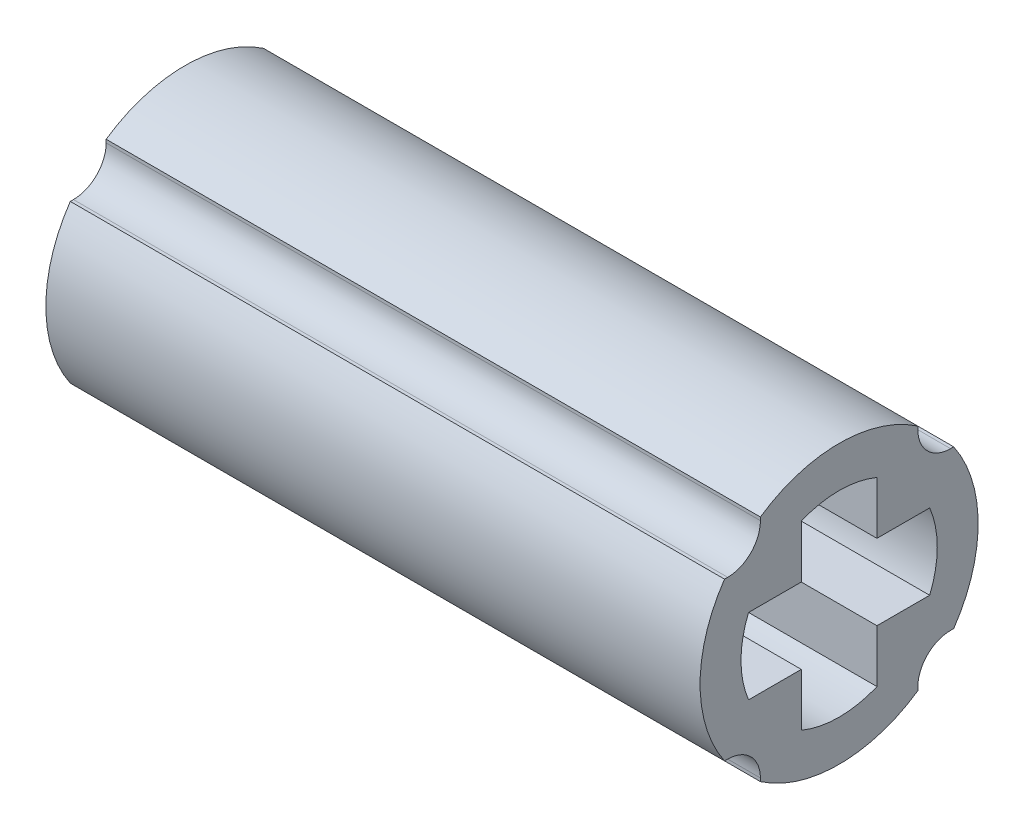
ISO-10303-21;
HEADER;
FILE_DESCRIPTION(('STEP AP214'),'2;1');
FILE_NAME('part.step','',(''),(''),'','','');
FILE_SCHEMA(('AUTOMOTIVE_DESIGN { 1 0 10303 214 1 1 1 1 }'));
ENDSEC;
DATA;
#1=APPLICATION_CONTEXT('core data for automotive mechanical design processes');
#2=APPLICATION_PROTOCOL_DEFINITION('international standard','automotive_design',2000,#1);
#3=PRODUCT_CONTEXT('',#1,'mechanical');
#4=PRODUCT('Part','Part','',(#3));
#5=PRODUCT_RELATED_PRODUCT_CATEGORY('part','',(#4));
#6=PRODUCT_DEFINITION_FORMATION('','',#4);
#7=PRODUCT_DEFINITION_CONTEXT('part definition',#1,'design');
#8=PRODUCT_DEFINITION('design','',#6,#7);
#9=PRODUCT_DEFINITION_SHAPE('','',#8);
#10=(LENGTH_UNIT() NAMED_UNIT(*) SI_UNIT(.MILLI.,.METRE.));
#11=(NAMED_UNIT(*) PLANE_ANGLE_UNIT() SI_UNIT($,.RADIAN.));
#12=(NAMED_UNIT(*) SI_UNIT($,.STERADIAN.) SOLID_ANGLE_UNIT());
#13=UNCERTAINTY_MEASURE_WITH_UNIT(LENGTH_MEASURE(1.E-05),#10,'distance_accuracy_value','');
#14=(GEOMETRIC_REPRESENTATION_CONTEXT(3) GLOBAL_UNCERTAINTY_ASSIGNED_CONTEXT((#13)) GLOBAL_UNIT_ASSIGNED_CONTEXT((#10,
#11,#12)) REPRESENTATION_CONTEXT('',''));
#15=CARTESIAN_POINT('',(0.,0.,0.));
#16=DIRECTION('',(0.,0.,1.));
#17=DIRECTION('',(1.,0.,0.));
#18=AXIS2_PLACEMENT_3D('',#15,#16,#17);
#19=CARTESIAN_POINT('',(16.,0.925,-0.925));
#20=DIRECTION('',(0.,0.,1.));
#21=DIRECTION('',(0.,-1.,0.));
#22=AXIS2_PLACEMENT_3D('',#19,#20,#21);
#23=PLANE('',#22);
#24=DIRECTION('',(0.,1.,0.));
#25=VECTOR('',#24,1.);
#26=CARTESIAN_POINT('',(0.,0.925,-0.925));
#27=LINE('',#26,#25);
#28=CARTESIAN_POINT('',(0.,0.925,-0.925));
#29=VERTEX_POINT('',#28);
#30=CARTESIAN_POINT('',(0.,2.2145823534021,-0.925));
#31=VERTEX_POINT('',#30);
#32=EDGE_CURVE('E279',#29,#31,#27,.T.);
#33=ORIENTED_EDGE('',*,*,#32,.F.);
#34=DIRECTION('',(-1.,0.,0.));
#35=VECTOR('',#34,1.);
#36=CARTESIAN_POINT('',(16.,0.925,-0.925));
#37=LINE('',#36,#35);
#38=CARTESIAN_POINT('',(16.,0.925,-0.925));
#39=VERTEX_POINT('',#38);
#40=EDGE_CURVE('E10',#39,#29,#37,.T.);
#41=ORIENTED_EDGE('',*,*,#40,.F.);
#42=DIRECTION('',(0.,1.,0.));
#43=VECTOR('',#42,1.);
#44=CARTESIAN_POINT('',(16.,0.925,-0.925));
#45=LINE('',#44,#43);
#46=CARTESIAN_POINT('',(16.,2.2145823534021,-0.925));
#47=VERTEX_POINT('',#46);
#48=EDGE_CURVE('E481',#39,#47,#45,.T.);
#49=ORIENTED_EDGE('',*,*,#48,.T.);
#50=DIRECTION('',(-1.,0.,0.));
#51=VECTOR('',#50,1.);
#52=CARTESIAN_POINT('',(16.,2.2145823534021,-0.925));
#53=LINE('',#52,#51);
#54=EDGE_CURVE('E331',#47,#31,#53,.T.);
#55=ORIENTED_EDGE('',*,*,#54,.T.);
#56=EDGE_LOOP('',(#33,#41,#49,#55));
#57=FACE_BOUND('',#56,.T.);
#58=ADVANCED_FACE('F16',(#57),#23,.T.);
#59=CARTESIAN_POINT('',(16.,0.925,-2.2145823534021));
#60=DIRECTION('',(0.,-1.,0.));
#61=DIRECTION('',(-1.,0.,0.));
#62=AXIS2_PLACEMENT_3D('',#59,#60,#61);
#63=PLANE('',#62);
#64=DIRECTION('',(0.,0.,1.));
#65=VECTOR('',#64,1.);
#66=CARTESIAN_POINT('',(0.,0.925,-2.2145823534021));
#67=LINE('',#66,#65);
#68=CARTESIAN_POINT('',(0.,0.925,-2.2145823534021));
#69=VERTEX_POINT('',#68);
#70=EDGE_CURVE('E201',#69,#29,#67,.T.);
#71=ORIENTED_EDGE('',*,*,#70,.F.);
#72=DIRECTION('',(-1.,0.,0.));
#73=VECTOR('',#72,1.);
#74=CARTESIAN_POINT('',(16.,0.925,-2.2145823534021));
#75=LINE('',#74,#73);
#76=CARTESIAN_POINT('',(16.,0.925,-2.2145823534021));
#77=VERTEX_POINT('',#76);
#78=EDGE_CURVE('E26',#77,#69,#75,.T.);
#79=ORIENTED_EDGE('',*,*,#78,.F.);
#80=DIRECTION('',(0.,0.,1.));
#81=VECTOR('',#80,1.);
#82=CARTESIAN_POINT('',(16.,0.925,-2.2145823534021));
#83=LINE('',#82,#81);
#84=EDGE_CURVE('E361',#77,#39,#83,.T.);
#85=ORIENTED_EDGE('',*,*,#84,.T.);
#86=ORIENTED_EDGE('',*,*,#40,.T.);
#87=EDGE_LOOP('',(#71,#79,#85,#86));
#88=FACE_BOUND('',#87,.T.);
#89=ADVANCED_FACE('F488',(#88),#63,.T.);
#90=CARTESIAN_POINT('',(16.,0.,0.));
#91=DIRECTION('',(-1.,0.,0.));
#92=DIRECTION('',(0.,-1.,0.));
#93=AXIS2_PLACEMENT_3D('',#90,#91,#92);
#94=CYLINDRICAL_SURFACE('',#93,2.4);
#95=CARTESIAN_POINT('',(0.,0.,0.));
#96=DIRECTION('',(1.,0.,0.));
#97=DIRECTION('',(0.,1.,0.));
#98=AXIS2_PLACEMENT_3D('',#95,#96,#97);
#99=CIRCLE('',#98,2.4);
#100=CARTESIAN_POINT('',(0.,-0.925,-2.2145823534021));
#101=VERTEX_POINT('',#100);
#102=EDGE_CURVE('E196',#101,#69,#99,.T.);
#103=ORIENTED_EDGE('',*,*,#102,.F.);
#104=DIRECTION('',(-1.,0.,0.));
#105=VECTOR('',#104,1.);
#106=CARTESIAN_POINT('',(16.,-0.925,-2.2145823534021));
#107=LINE('',#106,#105);
#108=CARTESIAN_POINT('',(16.,-0.925,-2.2145823534021));
#109=VERTEX_POINT('',#108);
#110=EDGE_CURVE('E19',#109,#101,#107,.T.);
#111=ORIENTED_EDGE('',*,*,#110,.F.);
#112=CARTESIAN_POINT('',(16.,0.,0.));
#113=DIRECTION('',(1.,0.,0.));
#114=DIRECTION('',(0.,1.,0.));
#115=AXIS2_PLACEMENT_3D('',#112,#113,#114);
#116=CIRCLE('',#115,2.4);
#117=EDGE_CURVE('E356',#109,#77,#116,.T.);
#118=ORIENTED_EDGE('',*,*,#117,.T.);
#119=ORIENTED_EDGE('',*,*,#78,.T.);
#120=EDGE_LOOP('',(#103,#111,#118,#119));
#121=FACE_BOUND('',#120,.T.);
#122=ADVANCED_FACE('F197',(#121),#94,.F.);
#123=CARTESIAN_POINT('',(16.,-0.925,-2.2145823534021));
#124=DIRECTION('',(0.,1.,0.));
#125=DIRECTION('',(0.,0.,-1.));
#126=AXIS2_PLACEMENT_3D('',#123,#124,#125);
#127=PLANE('',#126);
#128=DIRECTION('',(0.,0.,-1.));
#129=VECTOR('',#128,1.);
#130=CARTESIAN_POINT('',(0.,-0.925,-2.2145823534021));
#131=LINE('',#130,#129);
#132=CARTESIAN_POINT('',(0.,-0.925,-0.925));
#133=VERTEX_POINT('',#132);
#134=EDGE_CURVE('E186',#133,#101,#131,.T.);
#135=ORIENTED_EDGE('',*,*,#134,.F.);
#136=DIRECTION('',(-1.,0.,0.));
#137=VECTOR('',#136,1.);
#138=CARTESIAN_POINT('',(16.,-0.925,-0.925));
#139=LINE('',#138,#137);
#140=CARTESIAN_POINT('',(16.,-0.925,-0.925));
#141=VERTEX_POINT('',#140);
#142=EDGE_CURVE('E194',#141,#133,#139,.T.);
#143=ORIENTED_EDGE('',*,*,#142,.F.);
#144=DIRECTION('',(0.,0.,-1.));
#145=VECTOR('',#144,1.);
#146=CARTESIAN_POINT('',(16.,-0.925,-2.2145823534021));
#147=LINE('',#146,#145);
#148=EDGE_CURVE('E189',#141,#109,#147,.T.);
#149=ORIENTED_EDGE('',*,*,#148,.T.);
#150=ORIENTED_EDGE('',*,*,#110,.T.);
#151=EDGE_LOOP('',(#135,#143,#149,#150));
#152=FACE_BOUND('',#151,.T.);
#153=ADVANCED_FACE('F184',(#152),#127,.T.);
#154=CARTESIAN_POINT('',(16.,-2.2145823534021,-0.925));
#155=DIRECTION('',(0.,0.,1.));
#156=DIRECTION('',(0.,-1.,0.));
#157=AXIS2_PLACEMENT_3D('',#154,#155,#156);
#158=PLANE('',#157);
#159=DIRECTION('',(0.,1.,0.));
#160=VECTOR('',#159,1.);
#161=CARTESIAN_POINT('',(0.,-2.2145823534021,-0.925));
#162=LINE('',#161,#160);
#163=CARTESIAN_POINT('',(0.,-2.2145823534021,-0.925));
#164=VERTEX_POINT('',#163);
#165=EDGE_CURVE('E208',#164,#133,#162,.T.);
#166=ORIENTED_EDGE('',*,*,#165,.F.);
#167=DIRECTION('',(-1.,0.,0.));
#168=VECTOR('',#167,1.);
#169=CARTESIAN_POINT('',(16.,-2.2145823534021,-0.925));
#170=LINE('',#169,#168);
#171=CARTESIAN_POINT('',(16.,-2.2145823534021,-0.925));
#172=VERTEX_POINT('',#171);
#173=EDGE_CURVE('E313',#172,#164,#170,.T.);
#174=ORIENTED_EDGE('',*,*,#173,.F.);
#175=DIRECTION('',(0.,1.,0.));
#176=VECTOR('',#175,1.);
#177=CARTESIAN_POINT('',(16.,-2.2145823534021,-0.925));
#178=LINE('',#177,#176);
#179=EDGE_CURVE('E345',#172,#141,#178,.T.);
#180=ORIENTED_EDGE('',*,*,#179,.T.);
#181=ORIENTED_EDGE('',*,*,#142,.T.);
#182=EDGE_LOOP('',(#166,#174,#180,#181));
#183=FACE_BOUND('',#182,.T.);
#184=ADVANCED_FACE('F343',(#183),#158,.T.);
#185=CARTESIAN_POINT('',(16.,0.,0.));
#186=DIRECTION('',(-1.,0.,0.));
#187=DIRECTION('',(0.,-1.,0.));
#188=AXIS2_PLACEMENT_3D('',#185,#186,#187);
#189=CYLINDRICAL_SURFACE('',#188,2.4);
#190=CARTESIAN_POINT('',(0.,0.,0.));
#191=DIRECTION('',(1.,0.,0.));
#192=DIRECTION('',(0.,1.,0.));
#193=AXIS2_PLACEMENT_3D('',#190,#191,#192);
#194=CIRCLE('',#193,2.4);
#195=CARTESIAN_POINT('',(0.,-2.2145823534021,0.925));
#196=VERTEX_POINT('',#195);
#197=EDGE_CURVE('E214',#196,#164,#194,.T.);
#198=ORIENTED_EDGE('',*,*,#197,.F.);
#199=DIRECTION('',(-1.,0.,0.));
#200=VECTOR('',#199,1.);
#201=CARTESIAN_POINT('',(16.,-2.2145823534021,0.925));
#202=LINE('',#201,#200);
#203=CARTESIAN_POINT('',(16.,-2.2145823534021,0.925));
#204=VERTEX_POINT('',#203);
#205=EDGE_CURVE('E316',#204,#196,#202,.T.);
#206=ORIENTED_EDGE('',*,*,#205,.F.);
#207=CARTESIAN_POINT('',(16.,0.,0.));
#208=DIRECTION('',(1.,0.,0.));
#209=DIRECTION('',(0.,1.,0.));
#210=AXIS2_PLACEMENT_3D('',#207,#208,#209);
#211=CIRCLE('',#210,2.4);
#212=EDGE_CURVE('E350',#204,#172,#211,.T.);
#213=ORIENTED_EDGE('',*,*,#212,.T.);
#214=ORIENTED_EDGE('',*,*,#173,.T.);
#215=EDGE_LOOP('',(#198,#206,#213,#214));
#216=FACE_BOUND('',#215,.T.);
#217=ADVANCED_FACE('F938',(#216),#189,.F.);
#218=CARTESIAN_POINT('',(16.,-2.2145823534021,0.925));
#219=DIRECTION('',(0.,0.,-1.));
#220=DIRECTION('',(-1.,0.,0.));
#221=AXIS2_PLACEMENT_3D('',#218,#219,#220);
#222=PLANE('',#221);
#223=DIRECTION('',(0.,-1.,0.));
#224=VECTOR('',#223,1.);
#225=CARTESIAN_POINT('',(0.,-2.2145823534021,0.925));
#226=LINE('',#225,#224);
#227=CARTESIAN_POINT('',(0.,-0.925,0.925));
#228=VERTEX_POINT('',#227);
#229=EDGE_CURVE('E273',#228,#196,#226,.T.);
#230=ORIENTED_EDGE('',*,*,#229,.F.);
#231=DIRECTION('',(-1.,0.,0.));
#232=VECTOR('',#231,1.);
#233=CARTESIAN_POINT('',(16.,-0.925,0.925));
#234=LINE('',#233,#232);
#235=CARTESIAN_POINT('',(16.,-0.925,0.925));
#236=VERTEX_POINT('',#235);
#237=EDGE_CURVE('E338',#236,#228,#234,.T.);
#238=ORIENTED_EDGE('',*,*,#237,.F.);
#239=DIRECTION('',(0.,-1.,0.));
#240=VECTOR('',#239,1.);
#241=CARTESIAN_POINT('',(16.,-2.2145823534021,0.925));
#242=LINE('',#241,#240);
#243=EDGE_CURVE('E369',#236,#204,#242,.T.);
#244=ORIENTED_EDGE('',*,*,#243,.T.);
#245=ORIENTED_EDGE('',*,*,#205,.T.);
#246=EDGE_LOOP('',(#230,#238,#244,#245));
#247=FACE_BOUND('',#246,.T.);
#248=ADVANCED_FACE('F927',(#247),#222,.T.);
#249=CARTESIAN_POINT('',(16.,-0.925,0.925));
#250=DIRECTION('',(0.,1.,0.));
#251=DIRECTION('',(0.,0.,-1.));
#252=AXIS2_PLACEMENT_3D('',#249,#250,#251);
#253=PLANE('',#252);
#254=DIRECTION('',(0.,0.,-1.));
#255=VECTOR('',#254,1.);
#256=CARTESIAN_POINT('',(0.,-0.925,0.925));
#257=LINE('',#256,#255);
#258=CARTESIAN_POINT('',(0.,-0.925,2.2145823534021));
#259=VERTEX_POINT('',#258);
#260=EDGE_CURVE('E270',#259,#228,#257,.T.);
#261=ORIENTED_EDGE('',*,*,#260,.F.);
#262=DIRECTION('',(-1.,0.,0.));
#263=VECTOR('',#262,1.);
#264=CARTESIAN_POINT('',(16.,-0.925,2.2145823534021));
#265=LINE('',#264,#263);
#266=CARTESIAN_POINT('',(16.,-0.925,2.2145823534021));
#267=VERTEX_POINT('',#266);
#268=EDGE_CURVE('E292',#267,#259,#265,.T.);
#269=ORIENTED_EDGE('',*,*,#268,.F.);
#270=DIRECTION('',(0.,0.,-1.));
#271=VECTOR('',#270,1.);
#272=CARTESIAN_POINT('',(16.,-0.925,0.925));
#273=LINE('',#272,#271);
#274=EDGE_CURVE('E373',#267,#236,#273,.T.);
#275=ORIENTED_EDGE('',*,*,#274,.T.);
#276=ORIENTED_EDGE('',*,*,#237,.T.);
#277=EDGE_LOOP('',(#261,#269,#275,#276));
#278=FACE_BOUND('',#277,.T.);
#279=ADVANCED_FACE('F900',(#278),#253,.T.);
#280=CARTESIAN_POINT('',(16.,0.,0.));
#281=DIRECTION('',(-1.,0.,0.));
#282=DIRECTION('',(0.,-1.,0.));
#283=AXIS2_PLACEMENT_3D('',#280,#281,#282);
#284=CYLINDRICAL_SURFACE('',#283,2.4);
#285=CARTESIAN_POINT('',(0.,0.,0.));
#286=DIRECTION('',(1.,0.,0.));
#287=DIRECTION('',(0.,1.,0.));
#288=AXIS2_PLACEMENT_3D('',#285,#286,#287);
#289=CIRCLE('',#288,2.4);
#290=CARTESIAN_POINT('',(0.,0.925,2.2145823534021));
#291=VERTEX_POINT('',#290);
#292=EDGE_CURVE('E263',#291,#259,#289,.T.);
#293=ORIENTED_EDGE('',*,*,#292,.F.);
#294=DIRECTION('',(-1.,0.,0.));
#295=VECTOR('',#294,1.);
#296=CARTESIAN_POINT('',(16.,0.925,2.2145823534021));
#297=LINE('',#296,#295);
#298=CARTESIAN_POINT('',(16.,0.925,2.2145823534021));
#299=VERTEX_POINT('',#298);
#300=EDGE_CURVE('E289',#299,#291,#297,.T.);
#301=ORIENTED_EDGE('',*,*,#300,.F.);
#302=CARTESIAN_POINT('',(16.,0.,0.));
#303=DIRECTION('',(1.,0.,0.));
#304=DIRECTION('',(0.,1.,0.));
#305=AXIS2_PLACEMENT_3D('',#302,#303,#304);
#306=CIRCLE('',#305,2.4);
#307=EDGE_CURVE('E377',#299,#267,#306,.T.);
#308=ORIENTED_EDGE('',*,*,#307,.T.);
#309=ORIENTED_EDGE('',*,*,#268,.T.);
#310=EDGE_LOOP('',(#293,#301,#308,#309));
#311=FACE_BOUND('',#310,.T.);
#312=ADVANCED_FACE('F512',(#311),#284,.F.);
#313=CARTESIAN_POINT('',(16.,0.925,0.925));
#314=DIRECTION('',(0.,-1.,0.));
#315=DIRECTION('',(0.,0.,-1.));
#316=AXIS2_PLACEMENT_3D('',#313,#314,#315);
#317=PLANE('',#316);
#318=DIRECTION('',(0.,0.,1.));
#319=VECTOR('',#318,1.);
#320=CARTESIAN_POINT('',(0.,0.925,0.925));
#321=LINE('',#320,#319);
#322=CARTESIAN_POINT('',(0.,0.925,0.925));
#323=VERTEX_POINT('',#322);
#324=EDGE_CURVE('E259',#323,#291,#321,.T.);
#325=ORIENTED_EDGE('',*,*,#324,.F.);
#326=DIRECTION('',(-1.,0.,0.));
#327=VECTOR('',#326,1.);
#328=CARTESIAN_POINT('',(16.,0.925,0.925));
#329=LINE('',#328,#327);
#330=CARTESIAN_POINT('',(16.,0.925,0.925));
#331=VERTEX_POINT('',#330);
#332=EDGE_CURVE('E293',#331,#323,#329,.T.);
#333=ORIENTED_EDGE('',*,*,#332,.F.);
#334=DIRECTION('',(0.,0.,1.));
#335=VECTOR('',#334,1.);
#336=CARTESIAN_POINT('',(16.,0.925,0.925));
#337=LINE('',#336,#335);
#338=EDGE_CURVE('E383',#331,#299,#337,.T.);
#339=ORIENTED_EDGE('',*,*,#338,.T.);
#340=ORIENTED_EDGE('',*,*,#300,.T.);
#341=EDGE_LOOP('',(#325,#333,#339,#340));
#342=FACE_BOUND('',#341,.T.);
#343=ADVANCED_FACE('F508',(#342),#317,.T.);
#344=CARTESIAN_POINT('',(16.,0.925,0.925));
#345=DIRECTION('',(0.,0.,-1.));
#346=DIRECTION('',(-1.,0.,0.));
#347=AXIS2_PLACEMENT_3D('',#344,#345,#346);
#348=PLANE('',#347);
#349=DIRECTION('',(0.,-1.,0.));
#350=VECTOR('',#349,1.);
#351=CARTESIAN_POINT('',(0.,0.925,0.925));
#352=LINE('',#351,#350);
#353=CARTESIAN_POINT('',(0.,2.2145823534021,0.925));
#354=VERTEX_POINT('',#353);
#355=EDGE_CURVE('E255',#354,#323,#352,.T.);
#356=ORIENTED_EDGE('',*,*,#355,.F.);
#357=DIRECTION('',(-1.,0.,0.));
#358=VECTOR('',#357,1.);
#359=CARTESIAN_POINT('',(16.,2.2145823534021,0.925));
#360=LINE('',#359,#358);
#361=CARTESIAN_POINT('',(16.,2.2145823534021,0.925));
#362=VERTEX_POINT('',#361);
#363=EDGE_CURVE('E300',#362,#354,#360,.T.);
#364=ORIENTED_EDGE('',*,*,#363,.F.);
#365=DIRECTION('',(0.,-1.,0.));
#366=VECTOR('',#365,1.);
#367=CARTESIAN_POINT('',(16.,0.925,0.925));
#368=LINE('',#367,#366);
#369=EDGE_CURVE('E480',#362,#331,#368,.T.);
#370=ORIENTED_EDGE('',*,*,#369,.T.);
#371=ORIENTED_EDGE('',*,*,#332,.T.);
#372=EDGE_LOOP('',(#356,#364,#370,#371));
#373=FACE_BOUND('',#372,.T.);
#374=ADVANCED_FACE('F502',(#373),#348,.T.);
#375=CARTESIAN_POINT('',(16.,0.,0.));
#376=DIRECTION('',(-1.,0.,0.));
#377=DIRECTION('',(0.,-1.,0.));
#378=AXIS2_PLACEMENT_3D('',#375,#376,#377);
#379=CYLINDRICAL_SURFACE('',#378,2.4);
#380=CARTESIAN_POINT('',(0.,0.,0.));
#381=DIRECTION('',(1.,0.,0.));
#382=DIRECTION('',(0.,1.,0.));
#383=AXIS2_PLACEMENT_3D('',#380,#381,#382);
#384=CIRCLE('',#383,2.4);
#385=EDGE_CURVE('E252',#31,#354,#384,.T.);
#386=ORIENTED_EDGE('',*,*,#385,.F.);
#387=ORIENTED_EDGE('',*,*,#54,.F.);
#388=CARTESIAN_POINT('',(16.,0.,0.));
#389=DIRECTION('',(1.,0.,0.));
#390=DIRECTION('',(0.,1.,0.));
#391=AXIS2_PLACEMENT_3D('',#388,#389,#390);
#392=CIRCLE('',#391,2.4);
#393=EDGE_CURVE('E484',#47,#362,#392,.T.);
#394=ORIENTED_EDGE('',*,*,#393,.T.);
#395=ORIENTED_EDGE('',*,*,#363,.T.);
#396=EDGE_LOOP('',(#386,#387,#394,#395));
#397=FACE_BOUND('',#396,.T.);
#398=ADVANCED_FACE('F496',(#397),#379,.F.);
#399=CARTESIAN_POINT('',(16.,-2.80256578870149,1.925));
#400=DIRECTION('',(0.,0.,-1.));
#401=DIRECTION('',(0.,-1.,0.));
#402=AXIS2_PLACEMENT_3D('',#399,#400,#401);
#403=PLANE('',#402);
#404=DIRECTION('',(0.,-1.,0.));
#405=VECTOR('',#404,1.);
#406=CARTESIAN_POINT('',(0.,-2.80256578870149,1.925));
#407=LINE('',#406,#405);
#408=CARTESIAN_POINT('',(0.,-2.725,1.925));
#409=VERTEX_POINT('',#408);
#410=CARTESIAN_POINT('',(0.,-2.80256578870149,1.925));
#411=VERTEX_POINT('',#410);
#412=EDGE_CURVE('E391',#409,#411,#407,.T.);
#413=ORIENTED_EDGE('',*,*,#412,.T.);
#414=DIRECTION('',(-1.,0.,0.));
#415=VECTOR('',#414,1.);
#416=CARTESIAN_POINT('',(16.,-2.80256578870149,1.925));
#417=LINE('',#416,#415);
#418=CARTESIAN_POINT('',(16.,-2.80256578870149,1.925));
#419=VERTEX_POINT('',#418);
#420=EDGE_CURVE('E230',#419,#411,#417,.T.);
#421=ORIENTED_EDGE('',*,*,#420,.F.);
#422=DIRECTION('',(0.,-1.,0.));
#423=VECTOR('',#422,1.);
#424=CARTESIAN_POINT('',(16.,-2.80256578870149,1.925));
#425=LINE('',#424,#423);
#426=CARTESIAN_POINT('',(16.,-2.725,1.925));
#427=VERTEX_POINT('',#426);
#428=EDGE_CURVE('E474',#427,#419,#425,.T.);
#429=ORIENTED_EDGE('',*,*,#428,.F.);
#430=DIRECTION('',(-1.,0.,0.));
#431=VECTOR('',#430,1.);
#432=CARTESIAN_POINT('',(16.,-2.725,1.925));
#433=LINE('',#432,#431);
#434=EDGE_CURVE('E328',#427,#409,#433,.T.);
#435=ORIENTED_EDGE('',*,*,#434,.T.);
#436=EDGE_LOOP('',(#413,#421,#429,#435));
#437=FACE_BOUND('',#436,.T.);
#438=ADVANCED_FACE('F663',(#437),#403,.F.);
#439=CARTESIAN_POINT('',(16.,-2.725,2.725));
#440=DIRECTION('',(-1.,0.,0.));
#441=DIRECTION('',(0.,-1.,0.));
#442=AXIS2_PLACEMENT_3D('',#439,#440,#441);
#443=CYLINDRICAL_SURFACE('',#442,0.8);
#444=CARTESIAN_POINT('',(0.,-2.725,2.725));
#445=DIRECTION('',(-1.,0.,0.));
#446=DIRECTION('',(0.,1.,0.));
#447=AXIS2_PLACEMENT_3D('',#444,#445,#446);
#448=CIRCLE('',#447,0.8);
#449=CARTESIAN_POINT('',(0.,-1.925,2.725));
#450=VERTEX_POINT('',#449);
#451=EDGE_CURVE('E401',#450,#409,#448,.T.);
#452=ORIENTED_EDGE('',*,*,#451,.T.);
#453=ORIENTED_EDGE('',*,*,#434,.F.);
#454=CARTESIAN_POINT('',(16.,-2.725,2.725));
#455=DIRECTION('',(-1.,0.,0.));
#456=DIRECTION('',(0.,1.,0.));
#457=AXIS2_PLACEMENT_3D('',#454,#455,#456);
#458=CIRCLE('',#457,0.8);
#459=CARTESIAN_POINT('',(16.,-1.925,2.725));
#460=VERTEX_POINT('',#459);
#461=EDGE_CURVE('E466',#460,#427,#458,.T.);
#462=ORIENTED_EDGE('',*,*,#461,.F.);
#463=DIRECTION('',(-1.,0.,0.));
#464=VECTOR('',#463,1.);
#465=CARTESIAN_POINT('',(16.,-1.925,2.725));
#466=LINE('',#465,#464);
#467=EDGE_CURVE('E325',#460,#450,#466,.T.);
#468=ORIENTED_EDGE('',*,*,#467,.T.);
#469=EDGE_LOOP('',(#452,#453,#462,#468));
#470=FACE_BOUND('',#469,.T.);
#471=ADVANCED_FACE('F661',(#470),#443,.F.);
#472=CARTESIAN_POINT('',(16.,-1.925,2.725));
#473=DIRECTION('',(0.,1.,0.));
#474=DIRECTION('',(1.,0.,0.));
#475=AXIS2_PLACEMENT_3D('',#472,#473,#474);
#476=PLANE('',#475);
#477=DIRECTION('',(0.,0.,-1.));
#478=VECTOR('',#477,1.);
#479=CARTESIAN_POINT('',(0.,-1.925,2.725));
#480=LINE('',#479,#478);
#481=CARTESIAN_POINT('',(0.,-1.925,2.80256578870149));
#482=VERTEX_POINT('',#481);
#483=EDGE_CURVE('E400',#482,#450,#480,.T.);
#484=ORIENTED_EDGE('',*,*,#483,.T.);
#485=ORIENTED_EDGE('',*,*,#467,.F.);
#486=DIRECTION('',(0.,0.,-1.));
#487=VECTOR('',#486,1.);
#488=CARTESIAN_POINT('',(16.,-1.925,2.725));
#489=LINE('',#488,#487);
#490=CARTESIAN_POINT('',(16.,-1.925,2.80256578870149));
#491=VERTEX_POINT('',#490);
#492=EDGE_CURVE('E463',#491,#460,#489,.T.);
#493=ORIENTED_EDGE('',*,*,#492,.F.);
#494=DIRECTION('',(-1.,0.,0.));
#495=VECTOR('',#494,1.);
#496=CARTESIAN_POINT('',(16.,-1.925,2.80256578870149));
#497=LINE('',#496,#495);
#498=EDGE_CURVE('E322',#491,#482,#497,.T.);
#499=ORIENTED_EDGE('',*,*,#498,.T.);
#500=EDGE_LOOP('',(#484,#485,#493,#499));
#501=FACE_BOUND('',#500,.T.);
#502=ADVANCED_FACE('F657',(#501),#476,.F.);
#503=CARTESIAN_POINT('',(16.,0.,0.));
#504=DIRECTION('',(-1.,0.,0.));
#505=DIRECTION('',(0.,-1.,0.));
#506=AXIS2_PLACEMENT_3D('',#503,#504,#505);
#507=CYLINDRICAL_SURFACE('',#506,3.4);
#508=CARTESIAN_POINT('',(0.,0.,0.));
#509=DIRECTION('',(1.,0.,0.));
#510=DIRECTION('',(0.,1.,0.));
#511=AXIS2_PLACEMENT_3D('',#508,#509,#510);
#512=CIRCLE('',#511,3.4);
#513=CARTESIAN_POINT('',(0.,1.925,2.80256578870149));
#514=VERTEX_POINT('',#513);
#515=EDGE_CURVE('E395',#514,#482,#512,.T.);
#516=ORIENTED_EDGE('',*,*,#515,.T.);
#517=ORIENTED_EDGE('',*,*,#498,.F.);
#518=CARTESIAN_POINT('',(16.,0.,0.));
#519=DIRECTION('',(1.,0.,0.));
#520=DIRECTION('',(0.,1.,0.));
#521=AXIS2_PLACEMENT_3D('',#518,#519,#520);
#522=CIRCLE('',#521,3.4);
#523=CARTESIAN_POINT('',(16.,1.925,2.80256578870149));
#524=VERTEX_POINT('',#523);
#525=EDGE_CURVE('E460',#524,#491,#522,.T.);
#526=ORIENTED_EDGE('',*,*,#525,.F.);
#527=DIRECTION('',(-1.,0.,0.));
#528=VECTOR('',#527,1.);
#529=CARTESIAN_POINT('',(16.,1.925,2.80256578870149));
#530=LINE('',#529,#528);
#531=EDGE_CURVE('E319',#524,#514,#530,.T.);
#532=ORIENTED_EDGE('',*,*,#531,.T.);
#533=EDGE_LOOP('',(#516,#517,#526,#532));
#534=FACE_BOUND('',#533,.T.);
#535=ADVANCED_FACE('F653',(#534),#507,.T.);
#536=CARTESIAN_POINT('',(16.,1.925,2.725));
#537=DIRECTION('',(0.,-1.,0.));
#538=DIRECTION('',(0.,0.,-1.));
#539=AXIS2_PLACEMENT_3D('',#536,#537,#538);
#540=PLANE('',#539);
#541=DIRECTION('',(0.,0.,1.));
#542=VECTOR('',#541,1.);
#543=CARTESIAN_POINT('',(0.,1.925,2.725));
#544=LINE('',#543,#542);
#545=CARTESIAN_POINT('',(0.,1.925,2.725));
#546=VERTEX_POINT('',#545);
#547=EDGE_CURVE('E399',#546,#514,#544,.T.);
#548=ORIENTED_EDGE('',*,*,#547,.T.);
#549=ORIENTED_EDGE('',*,*,#531,.F.);
#550=DIRECTION('',(0.,0.,1.));
#551=VECTOR('',#550,1.);
#552=CARTESIAN_POINT('',(16.,1.925,2.725));
#553=LINE('',#552,#551);
#554=CARTESIAN_POINT('',(16.,1.925,2.725));
#555=VERTEX_POINT('',#554);
#556=EDGE_CURVE('E456',#555,#524,#553,.T.);
#557=ORIENTED_EDGE('',*,*,#556,.F.);
#558=DIRECTION('',(-1.,0.,0.));
#559=VECTOR('',#558,1.);
#560=CARTESIAN_POINT('',(16.,1.925,2.725));
#561=LINE('',#560,#559);
#562=EDGE_CURVE('E312',#555,#546,#561,.T.);
#563=ORIENTED_EDGE('',*,*,#562,.T.);
#564=EDGE_LOOP('',(#548,#549,#557,#563));
#565=FACE_BOUND('',#564,.T.);
#566=ADVANCED_FACE('F649',(#565),#540,.F.);
#567=CARTESIAN_POINT('',(16.,2.725,2.725));
#568=DIRECTION('',(-1.,0.,0.));
#569=DIRECTION('',(0.,-1.,0.));
#570=AXIS2_PLACEMENT_3D('',#567,#568,#569);
#571=CYLINDRICAL_SURFACE('',#570,0.8);
#572=CARTESIAN_POINT('',(0.,2.725,2.725));
#573=DIRECTION('',(-1.,0.,0.));
#574=DIRECTION('',(0.,1.,0.));
#575=AXIS2_PLACEMENT_3D('',#572,#573,#574);
#576=CIRCLE('',#575,0.8);
#577=CARTESIAN_POINT('',(0.,2.725,1.925));
#578=VERTEX_POINT('',#577);
#579=EDGE_CURVE('E218',#578,#546,#576,.T.);
#580=ORIENTED_EDGE('',*,*,#579,.T.);
#581=ORIENTED_EDGE('',*,*,#562,.F.);
#582=CARTESIAN_POINT('',(16.,2.725,2.725));
#583=DIRECTION('',(-1.,0.,0.));
#584=DIRECTION('',(0.,1.,0.));
#585=AXIS2_PLACEMENT_3D('',#582,#583,#584);
#586=CIRCLE('',#585,0.8);
#587=CARTESIAN_POINT('',(16.,2.725,1.925));
#588=VERTEX_POINT('',#587);
#589=EDGE_CURVE('E440',#588,#555,#586,.T.);
#590=ORIENTED_EDGE('',*,*,#589,.F.);
#591=DIRECTION('',(-1.,0.,0.));
#592=VECTOR('',#591,1.);
#593=CARTESIAN_POINT('',(16.,2.725,1.925));
#594=LINE('',#593,#592);
#595=EDGE_CURVE('E309',#588,#578,#594,.T.);
#596=ORIENTED_EDGE('',*,*,#595,.T.);
#597=EDGE_LOOP('',(#580,#581,#590,#596));
#598=FACE_BOUND('',#597,.T.);
#599=ADVANCED_FACE('F647',(#598),#571,.F.);
#600=CARTESIAN_POINT('',(16.,2.725,1.925));
#601=DIRECTION('',(0.,0.,-1.));
#602=DIRECTION('',(0.,-1.,0.));
#603=AXIS2_PLACEMENT_3D('',#600,#601,#602);
#604=PLANE('',#603);
#605=DIRECTION('',(0.,-1.,0.));
#606=VECTOR('',#605,1.);
#607=CARTESIAN_POINT('',(0.,2.725,1.925));
#608=LINE('',#607,#606);
#609=CARTESIAN_POINT('',(0.,2.80256578870149,1.925));
#610=VERTEX_POINT('',#609);
#611=EDGE_CURVE('E220',#610,#578,#608,.T.);
#612=ORIENTED_EDGE('',*,*,#611,.T.);
#613=ORIENTED_EDGE('',*,*,#595,.F.);
#614=DIRECTION('',(0.,-1.,0.));
#615=VECTOR('',#614,1.);
#616=CARTESIAN_POINT('',(16.,2.725,1.925));
#617=LINE('',#616,#615);
#618=CARTESIAN_POINT('',(16.,2.80256578870149,1.925));
#619=VERTEX_POINT('',#618);
#620=EDGE_CURVE('E433',#619,#588,#617,.T.);
#621=ORIENTED_EDGE('',*,*,#620,.F.);
#622=DIRECTION('',(-1.,0.,0.));
#623=VECTOR('',#622,1.);
#624=CARTESIAN_POINT('',(16.,2.80256578870149,1.925));
#625=LINE('',#624,#623);
#626=EDGE_CURVE('E306',#619,#610,#625,.T.);
#627=ORIENTED_EDGE('',*,*,#626,.T.);
#628=EDGE_LOOP('',(#612,#613,#621,#627));
#629=FACE_BOUND('',#628,.T.);
#630=ADVANCED_FACE('F429',(#629),#604,.F.);
#631=CARTESIAN_POINT('',(16.,0.,0.));
#632=DIRECTION('',(-1.,0.,0.));
#633=DIRECTION('',(0.,-1.,0.));
#634=AXIS2_PLACEMENT_3D('',#631,#632,#633);
#635=CYLINDRICAL_SURFACE('',#634,3.4);
#636=CARTESIAN_POINT('',(0.,0.,0.));
#637=DIRECTION('',(1.,0.,0.));
#638=DIRECTION('',(0.,1.,0.));
#639=AXIS2_PLACEMENT_3D('',#636,#637,#638);
#640=CIRCLE('',#639,3.4);
#641=CARTESIAN_POINT('',(0.,2.80256578870149,-1.925));
#642=VERTEX_POINT('',#641);
#643=EDGE_CURVE('E224',#642,#610,#640,.T.);
#644=ORIENTED_EDGE('',*,*,#643,.T.);
#645=ORIENTED_EDGE('',*,*,#626,.F.);
#646=CARTESIAN_POINT('',(16.,0.,0.));
#647=DIRECTION('',(1.,0.,0.));
#648=DIRECTION('',(0.,1.,0.));
#649=AXIS2_PLACEMENT_3D('',#646,#647,#648);
#650=CIRCLE('',#649,3.4);
#651=CARTESIAN_POINT('',(16.,2.80256578870149,-1.925));
#652=VERTEX_POINT('',#651);
#653=EDGE_CURVE('E441',#652,#619,#650,.T.);
#654=ORIENTED_EDGE('',*,*,#653,.F.);
#655=DIRECTION('',(-1.,0.,0.));
#656=VECTOR('',#655,1.);
#657=CARTESIAN_POINT('',(16.,2.80256578870149,-1.925));
#658=LINE('',#657,#656);
#659=EDGE_CURVE('E303',#652,#642,#658,.T.);
#660=ORIENTED_EDGE('',*,*,#659,.T.);
#661=EDGE_LOOP('',(#644,#645,#654,#660));
#662=FACE_BOUND('',#661,.T.);
#663=ADVANCED_FACE('F417',(#662),#635,.T.);
#664=CARTESIAN_POINT('',(16.,2.725,-1.925));
#665=DIRECTION('',(0.,0.,1.));
#666=DIRECTION('',(1.,0.,0.));
#667=AXIS2_PLACEMENT_3D('',#664,#665,#666);
#668=PLANE('',#667);
#669=DIRECTION('',(0.,1.,0.));
#670=VECTOR('',#669,1.);
#671=CARTESIAN_POINT('',(0.,2.725,-1.925));
#672=LINE('',#671,#670);
#673=CARTESIAN_POINT('',(0.,2.725,-1.925));
#674=VERTEX_POINT('',#673);
#675=EDGE_CURVE('E225',#674,#642,#672,.T.);
#676=ORIENTED_EDGE('',*,*,#675,.T.);
#677=ORIENTED_EDGE('',*,*,#659,.F.);
#678=DIRECTION('',(0.,1.,0.));
#679=VECTOR('',#678,1.);
#680=CARTESIAN_POINT('',(16.,2.725,-1.925));
#681=LINE('',#680,#679);
#682=CARTESIAN_POINT('',(16.,2.725,-1.925));
#683=VERTEX_POINT('',#682);
#684=EDGE_CURVE('E447',#683,#652,#681,.T.);
#685=ORIENTED_EDGE('',*,*,#684,.F.);
#686=DIRECTION('',(-1.,0.,0.));
#687=VECTOR('',#686,1.);
#688=CARTESIAN_POINT('',(16.,2.725,-1.925));
#689=LINE('',#688,#687);
#690=EDGE_CURVE('E297',#683,#674,#689,.T.);
#691=ORIENTED_EDGE('',*,*,#690,.T.);
#692=EDGE_LOOP('',(#676,#677,#685,#691));
#693=FACE_BOUND('',#692,.T.);
#694=ADVANCED_FACE('F694',(#693),#668,.F.);
#695=CARTESIAN_POINT('',(16.,2.725,-2.725));
#696=DIRECTION('',(-1.,0.,0.));
#697=DIRECTION('',(0.,-1.,0.));
#698=AXIS2_PLACEMENT_3D('',#695,#696,#697);
#699=CYLINDRICAL_SURFACE('',#698,0.8);
#700=CARTESIAN_POINT('',(0.,2.725,-2.725));
#701=DIRECTION('',(-1.,0.,0.));
#702=DIRECTION('',(0.,1.,0.));
#703=AXIS2_PLACEMENT_3D('',#700,#701,#702);
#704=CIRCLE('',#703,0.8);
#705=CARTESIAN_POINT('',(0.,1.925,-2.725));
#706=VERTEX_POINT('',#705);
#707=EDGE_CURVE('E229',#706,#674,#704,.T.);
#708=ORIENTED_EDGE('',*,*,#707,.T.);
#709=ORIENTED_EDGE('',*,*,#690,.F.);
#710=CARTESIAN_POINT('',(16.,2.725,-2.725));
#711=DIRECTION('',(-1.,0.,0.));
#712=DIRECTION('',(0.,1.,0.));
#713=AXIS2_PLACEMENT_3D('',#710,#711,#712);
#714=CIRCLE('',#713,0.8);
#715=CARTESIAN_POINT('',(16.,1.925,-2.725));
#716=VERTEX_POINT('',#715);
#717=EDGE_CURVE('E452',#716,#683,#714,.T.);
#718=ORIENTED_EDGE('',*,*,#717,.F.);
#719=DIRECTION('',(-1.,0.,0.));
#720=VECTOR('',#719,1.);
#721=CARTESIAN_POINT('',(16.,1.925,-2.725));
#722=LINE('',#721,#720);
#723=EDGE_CURVE('E294',#716,#706,#722,.T.);
#724=ORIENTED_EDGE('',*,*,#723,.T.);
#725=EDGE_LOOP('',(#708,#709,#718,#724));
#726=FACE_BOUND('',#725,.T.);
#727=ADVANCED_FACE('F703',(#726),#699,.F.);
#728=CARTESIAN_POINT('',(16.,1.925,-2.80256578870149));
#729=DIRECTION('',(0.,-1.,0.));
#730=DIRECTION('',(0.,0.,-1.));
#731=AXIS2_PLACEMENT_3D('',#728,#729,#730);
#732=PLANE('',#731);
#733=DIRECTION('',(0.,0.,1.));
#734=VECTOR('',#733,1.);
#735=CARTESIAN_POINT('',(0.,1.925,-2.80256578870149));
#736=LINE('',#735,#734);
#737=CARTESIAN_POINT('',(0.,1.925,-2.80256578870149));
#738=VERTEX_POINT('',#737);
#739=EDGE_CURVE('E235',#738,#706,#736,.T.);
#740=ORIENTED_EDGE('',*,*,#739,.T.);
#741=ORIENTED_EDGE('',*,*,#723,.F.);
#742=DIRECTION('',(0.,0.,1.));
#743=VECTOR('',#742,1.);
#744=CARTESIAN_POINT('',(16.,1.925,-2.80256578870149));
#745=LINE('',#744,#743);
#746=CARTESIAN_POINT('',(16.,1.925,-2.80256578870149));
#747=VERTEX_POINT('',#746);
#748=EDGE_CURVE('E519',#747,#716,#745,.T.);
#749=ORIENTED_EDGE('',*,*,#748,.F.);
#750=DIRECTION('',(-1.,0.,0.));
#751=VECTOR('',#750,1.);
#752=CARTESIAN_POINT('',(16.,1.925,-2.80256578870149));
#753=LINE('',#752,#751);
#754=EDGE_CURVE('E268',#747,#738,#753,.T.);
#755=ORIENTED_EDGE('',*,*,#754,.T.);
#756=EDGE_LOOP('',(#740,#741,#749,#755));
#757=FACE_BOUND('',#756,.T.);
#758=ADVANCED_FACE('F699',(#757),#732,.F.);
#759=CARTESIAN_POINT('',(16.,0.,0.));
#760=DIRECTION('',(-1.,0.,0.));
#761=DIRECTION('',(0.,-1.,0.));
#762=AXIS2_PLACEMENT_3D('',#759,#760,#761);
#763=CYLINDRICAL_SURFACE('',#762,3.4);
#764=CARTESIAN_POINT('',(0.,0.,0.));
#765=DIRECTION('',(1.,0.,0.));
#766=DIRECTION('',(0.,1.,0.));
#767=AXIS2_PLACEMENT_3D('',#764,#765,#766);
#768=CIRCLE('',#767,3.4);
#769=CARTESIAN_POINT('',(0.,-1.925,-2.80256578870149));
#770=VERTEX_POINT('',#769);
#771=EDGE_CURVE('E239',#770,#738,#768,.T.);
#772=ORIENTED_EDGE('',*,*,#771,.T.);
#773=ORIENTED_EDGE('',*,*,#754,.F.);
#774=CARTESIAN_POINT('',(16.,0.,0.));
#775=DIRECTION('',(1.,0.,0.));
#776=DIRECTION('',(0.,1.,0.));
#777=AXIS2_PLACEMENT_3D('',#774,#775,#776);
#778=CIRCLE('',#777,3.4);
#779=CARTESIAN_POINT('',(16.,-1.925,-2.80256578870149));
#780=VERTEX_POINT('',#779);
#781=EDGE_CURVE('E525',#780,#747,#778,.T.);
#782=ORIENTED_EDGE('',*,*,#781,.F.);
#783=DIRECTION('',(-1.,0.,0.));
#784=VECTOR('',#783,1.);
#785=CARTESIAN_POINT('',(16.,-1.925,-2.80256578870149));
#786=LINE('',#785,#784);
#787=EDGE_CURVE('E264',#780,#770,#786,.T.);
#788=ORIENTED_EDGE('',*,*,#787,.T.);
#789=EDGE_LOOP('',(#772,#773,#782,#788));
#790=FACE_BOUND('',#789,.T.);
#791=ADVANCED_FACE('F690',(#790),#763,.T.);
#792=CARTESIAN_POINT('',(16.,-1.925,-2.80256578870149));
#793=DIRECTION('',(0.,1.,0.));
#794=DIRECTION('',(1.,0.,0.));
#795=AXIS2_PLACEMENT_3D('',#792,#793,#794);
#796=PLANE('',#795);
#797=DIRECTION('',(0.,0.,-1.));
#798=VECTOR('',#797,1.);
#799=CARTESIAN_POINT('',(0.,-1.925,-2.80256578870149));
#800=LINE('',#799,#798);
#801=CARTESIAN_POINT('',(0.,-1.925,-2.725));
#802=VERTEX_POINT('',#801);
#803=EDGE_CURVE('E243',#802,#770,#800,.T.);
#804=ORIENTED_EDGE('',*,*,#803,.T.);
#805=ORIENTED_EDGE('',*,*,#787,.F.);
#806=DIRECTION('',(0.,0.,-1.));
#807=VECTOR('',#806,1.);
#808=CARTESIAN_POINT('',(16.,-1.925,-2.80256578870149));
#809=LINE('',#808,#807);
#810=CARTESIAN_POINT('',(16.,-1.925,-2.725));
#811=VERTEX_POINT('',#810);
#812=EDGE_CURVE('E535',#811,#780,#809,.T.);
#813=ORIENTED_EDGE('',*,*,#812,.F.);
#814=DIRECTION('',(-1.,0.,0.));
#815=VECTOR('',#814,1.);
#816=CARTESIAN_POINT('',(16.,-1.925,-2.725));
#817=LINE('',#816,#815);
#818=EDGE_CURVE('E269',#811,#802,#817,.T.);
#819=ORIENTED_EDGE('',*,*,#818,.T.);
#820=EDGE_LOOP('',(#804,#805,#813,#819));
#821=FACE_BOUND('',#820,.T.);
#822=ADVANCED_FACE('F687',(#821),#796,.F.);
#823=CARTESIAN_POINT('',(16.,-2.725,-2.725));
#824=DIRECTION('',(-1.,0.,0.));
#825=DIRECTION('',(0.,-1.,0.));
#826=AXIS2_PLACEMENT_3D('',#823,#824,#825);
#827=CYLINDRICAL_SURFACE('',#826,0.8);
#828=CARTESIAN_POINT('',(0.,-2.725,-2.725));
#829=DIRECTION('',(-1.,0.,0.));
#830=DIRECTION('',(0.,1.,0.));
#831=AXIS2_PLACEMENT_3D('',#828,#829,#830);
#832=CIRCLE('',#831,0.8);
#833=CARTESIAN_POINT('',(0.,-2.725,-1.925));
#834=VERTEX_POINT('',#833);
#835=EDGE_CURVE('E244',#834,#802,#832,.T.);
#836=ORIENTED_EDGE('',*,*,#835,.T.);
#837=ORIENTED_EDGE('',*,*,#818,.F.);
#838=CARTESIAN_POINT('',(16.,-2.725,-2.725));
#839=DIRECTION('',(-1.,0.,0.));
#840=DIRECTION('',(0.,1.,0.));
#841=AXIS2_PLACEMENT_3D('',#838,#839,#840);
#842=CIRCLE('',#841,0.8);
#843=CARTESIAN_POINT('',(16.,-2.725,-1.925));
#844=VERTEX_POINT('',#843);
#845=EDGE_CURVE('E540',#844,#811,#842,.T.);
#846=ORIENTED_EDGE('',*,*,#845,.F.);
#847=DIRECTION('',(-1.,0.,0.));
#848=VECTOR('',#847,1.);
#849=CARTESIAN_POINT('',(16.,-2.725,-1.925));
#850=LINE('',#849,#848);
#851=EDGE_CURVE('E233',#844,#834,#850,.T.);
#852=ORIENTED_EDGE('',*,*,#851,.T.);
#853=EDGE_LOOP('',(#836,#837,#846,#852));
#854=FACE_BOUND('',#853,.T.);
#855=ADVANCED_FACE('F683',(#854),#827,.F.);
#856=CARTESIAN_POINT('',(16.,-2.80256578870149,-1.925));
#857=DIRECTION('',(0.,0.,1.));
#858=DIRECTION('',(1.,0.,0.));
#859=AXIS2_PLACEMENT_3D('',#856,#857,#858);
#860=PLANE('',#859);
#861=DIRECTION('',(0.,1.,0.));
#862=VECTOR('',#861,1.);
#863=CARTESIAN_POINT('',(0.,-2.80256578870149,-1.925));
#864=LINE('',#863,#862);
#865=CARTESIAN_POINT('',(0.,-2.80256578870149,-1.925));
#866=VERTEX_POINT('',#865);
#867=EDGE_CURVE('E248',#866,#834,#864,.T.);
#868=ORIENTED_EDGE('',*,*,#867,.T.);
#869=ORIENTED_EDGE('',*,*,#851,.F.);
#870=DIRECTION('',(0.,1.,0.));
#871=VECTOR('',#870,1.);
#872=CARTESIAN_POINT('',(16.,-2.80256578870149,-1.925));
#873=LINE('',#872,#871);
#874=CARTESIAN_POINT('',(16.,-2.80256578870149,-1.925));
#875=VERTEX_POINT('',#874);
#876=EDGE_CURVE('E544',#875,#844,#873,.T.);
#877=ORIENTED_EDGE('',*,*,#876,.F.);
#878=DIRECTION('',(-1.,0.,0.));
#879=VECTOR('',#878,1.);
#880=CARTESIAN_POINT('',(16.,-2.80256578870149,-1.925));
#881=LINE('',#880,#879);
#882=EDGE_CURVE('E234',#875,#866,#881,.T.);
#883=ORIENTED_EDGE('',*,*,#882,.T.);
#884=EDGE_LOOP('',(#868,#869,#877,#883));
#885=FACE_BOUND('',#884,.T.);
#886=ADVANCED_FACE('F780',(#885),#860,.F.);
#887=CARTESIAN_POINT('',(16.,0.,0.));
#888=DIRECTION('',(-1.,0.,0.));
#889=DIRECTION('',(0.,-1.,0.));
#890=AXIS2_PLACEMENT_3D('',#887,#888,#889);
#891=CYLINDRICAL_SURFACE('',#890,3.4);
#892=CARTESIAN_POINT('',(0.,0.,0.));
#893=DIRECTION('',(1.,0.,0.));
#894=DIRECTION('',(0.,1.,0.));
#895=AXIS2_PLACEMENT_3D('',#892,#893,#894);
#896=CIRCLE('',#895,3.4);
#897=EDGE_CURVE('E387',#411,#866,#896,.T.);
#898=ORIENTED_EDGE('',*,*,#897,.T.);
#899=ORIENTED_EDGE('',*,*,#882,.F.);
#900=CARTESIAN_POINT('',(16.,0.,0.));
#901=DIRECTION('',(1.,0.,0.));
#902=DIRECTION('',(0.,1.,0.));
#903=AXIS2_PLACEMENT_3D('',#900,#901,#902);
#904=CIRCLE('',#903,3.4);
#905=EDGE_CURVE('E548',#419,#875,#904,.T.);
#906=ORIENTED_EDGE('',*,*,#905,.F.);
#907=ORIENTED_EDGE('',*,*,#420,.T.);
#908=EDGE_LOOP('',(#898,#899,#906,#907));
#909=FACE_BOUND('',#908,.T.);
#910=ADVANCED_FACE('F567',(#909),#891,.T.);
#911=CARTESIAN_POINT('',(0.,0.,0.));
#912=DIRECTION('',(1.,0.,0.));
#913=DIRECTION('',(0.,1.,0.));
#914=AXIS2_PLACEMENT_3D('',#911,#912,#913);
#915=PLANE('',#914);
#916=ORIENTED_EDGE('',*,*,#385,.T.);
#917=ORIENTED_EDGE('',*,*,#355,.T.);
#918=ORIENTED_EDGE('',*,*,#324,.T.);
#919=ORIENTED_EDGE('',*,*,#292,.T.);
#920=ORIENTED_EDGE('',*,*,#260,.T.);
#921=ORIENTED_EDGE('',*,*,#229,.T.);
#922=ORIENTED_EDGE('',*,*,#197,.T.);
#923=ORIENTED_EDGE('',*,*,#165,.T.);
#924=ORIENTED_EDGE('',*,*,#134,.T.);
#925=ORIENTED_EDGE('',*,*,#102,.T.);
#926=ORIENTED_EDGE('',*,*,#70,.T.);
#927=ORIENTED_EDGE('',*,*,#32,.T.);
#928=EDGE_LOOP('',(#916,#917,#918,#919,#920,#921,#922,#923,#924,#925,#926,#927));
#929=FACE_BOUND('',#928,.T.);
#930=ORIENTED_EDGE('',*,*,#897,.F.);
#931=ORIENTED_EDGE('',*,*,#412,.F.);
#932=ORIENTED_EDGE('',*,*,#451,.F.);
#933=ORIENTED_EDGE('',*,*,#483,.F.);
#934=ORIENTED_EDGE('',*,*,#515,.F.);
#935=ORIENTED_EDGE('',*,*,#547,.F.);
#936=ORIENTED_EDGE('',*,*,#579,.F.);
#937=ORIENTED_EDGE('',*,*,#611,.F.);
#938=ORIENTED_EDGE('',*,*,#643,.F.);
#939=ORIENTED_EDGE('',*,*,#675,.F.);
#940=ORIENTED_EDGE('',*,*,#707,.F.);
#941=ORIENTED_EDGE('',*,*,#739,.F.);
#942=ORIENTED_EDGE('',*,*,#771,.F.);
#943=ORIENTED_EDGE('',*,*,#803,.F.);
#944=ORIENTED_EDGE('',*,*,#835,.F.);
#945=ORIENTED_EDGE('',*,*,#867,.F.);
#946=EDGE_LOOP('',(#930,#931,#932,#933,#934,#935,#936,#937,#938,#939,#940,#941,#942,#943,#944,#945));
#947=FACE_BOUND('',#946,.T.);
#948=ADVANCED_FACE('F204',(#929,#947),#915,.F.);
#949=CARTESIAN_POINT('',(16.,0.,0.));
#950=DIRECTION('',(1.,0.,0.));
#951=DIRECTION('',(0.,1.,0.));
#952=AXIS2_PLACEMENT_3D('',#949,#950,#951);
#953=PLANE('',#952);
#954=ORIENTED_EDGE('',*,*,#369,.F.);
#955=ORIENTED_EDGE('',*,*,#393,.F.);
#956=ORIENTED_EDGE('',*,*,#48,.F.);
#957=ORIENTED_EDGE('',*,*,#84,.F.);
#958=ORIENTED_EDGE('',*,*,#117,.F.);
#959=ORIENTED_EDGE('',*,*,#148,.F.);
#960=ORIENTED_EDGE('',*,*,#179,.F.);
#961=ORIENTED_EDGE('',*,*,#212,.F.);
#962=ORIENTED_EDGE('',*,*,#243,.F.);
#963=ORIENTED_EDGE('',*,*,#274,.F.);
#964=ORIENTED_EDGE('',*,*,#307,.F.);
#965=ORIENTED_EDGE('',*,*,#338,.F.);
#966=EDGE_LOOP('',(#954,#955,#956,#957,#958,#959,#960,#961,#962,#963,#964,#965));
#967=FACE_BOUND('',#966,.T.);
#968=ORIENTED_EDGE('',*,*,#905,.T.);
#969=ORIENTED_EDGE('',*,*,#876,.T.);
#970=ORIENTED_EDGE('',*,*,#845,.T.);
#971=ORIENTED_EDGE('',*,*,#812,.T.);
#972=ORIENTED_EDGE('',*,*,#781,.T.);
#973=ORIENTED_EDGE('',*,*,#748,.T.);
#974=ORIENTED_EDGE('',*,*,#717,.T.);
#975=ORIENTED_EDGE('',*,*,#684,.T.);
#976=ORIENTED_EDGE('',*,*,#653,.T.);
#977=ORIENTED_EDGE('',*,*,#620,.T.);
#978=ORIENTED_EDGE('',*,*,#589,.T.);
#979=ORIENTED_EDGE('',*,*,#556,.T.);
#980=ORIENTED_EDGE('',*,*,#525,.T.);
#981=ORIENTED_EDGE('',*,*,#492,.T.);
#982=ORIENTED_EDGE('',*,*,#461,.T.);
#983=ORIENTED_EDGE('',*,*,#428,.T.);
#984=EDGE_LOOP('',(#968,#969,#970,#971,#972,#973,#974,#975,#976,#977,#978,#979,#980,#981,#982,#983));
#985=FACE_BOUND('',#984,.T.);
#986=ADVANCED_FACE('F353',(#967,#985),#953,.T.);
#987=CLOSED_SHELL('',(#58,#89,#122,#153,#184,#217,#248,#279,#312,#343,#374,#398,#438,#471,#502,
#535,#566,#599,#630,#663,#694,#727,#758,#791,#822,#855,#886,#910,#948,#986));
#988=MANIFOLD_SOLID_BREP('B1',#987);
#989=ADVANCED_BREP_SHAPE_REPRESENTATION('',(#18,#988),#14);
#990=SHAPE_DEFINITION_REPRESENTATION(#9,#989);
ENDSEC;
END-ISO-10303-21;
